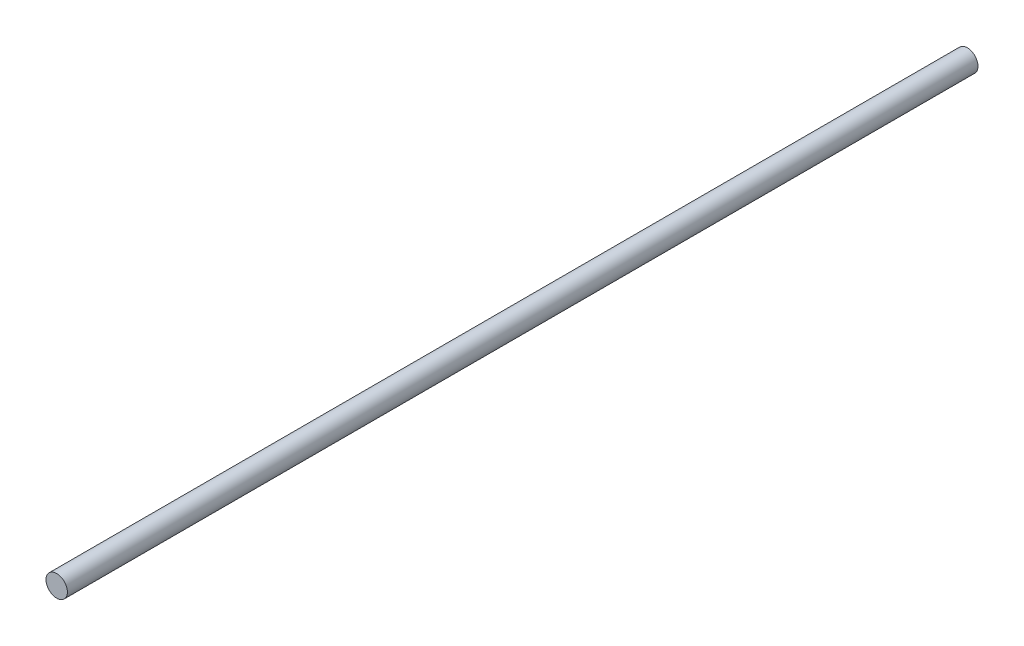
ISO-10303-21;
HEADER;
FILE_DESCRIPTION(('STEP AP214'),'2;1');
FILE_NAME('part.step','',(''),(''),'','','');
FILE_SCHEMA(('AUTOMOTIVE_DESIGN { 1 0 10303 214 1 1 1 1 }'));
ENDSEC;
DATA;
#1=APPLICATION_CONTEXT('core data for automotive mechanical design processes');
#2=APPLICATION_PROTOCOL_DEFINITION('international standard','automotive_design',2000,#1);
#3=PRODUCT_CONTEXT('',#1,'mechanical');
#4=PRODUCT('Part','Part','',(#3));
#5=PRODUCT_RELATED_PRODUCT_CATEGORY('part','',(#4));
#6=PRODUCT_DEFINITION_FORMATION('','',#4);
#7=PRODUCT_DEFINITION_CONTEXT('part definition',#1,'design');
#8=PRODUCT_DEFINITION('design','',#6,#7);
#9=PRODUCT_DEFINITION_SHAPE('','',#8);
#10=(LENGTH_UNIT() NAMED_UNIT(*) SI_UNIT(.MILLI.,.METRE.));
#11=(NAMED_UNIT(*) PLANE_ANGLE_UNIT() SI_UNIT($,.RADIAN.));
#12=(NAMED_UNIT(*) SI_UNIT($,.STERADIAN.) SOLID_ANGLE_UNIT());
#13=UNCERTAINTY_MEASURE_WITH_UNIT(LENGTH_MEASURE(1.E-05),#10,'distance_accuracy_value','');
#14=(GEOMETRIC_REPRESENTATION_CONTEXT(3) GLOBAL_UNCERTAINTY_ASSIGNED_CONTEXT((#13)) GLOBAL_UNIT_ASSIGNED_CONTEXT((#10,
#11,#12)) REPRESENTATION_CONTEXT('',''));
#15=CARTESIAN_POINT('',(0.,0.,0.));
#16=DIRECTION('',(0.,0.,1.));
#17=DIRECTION('',(1.,0.,0.));
#18=AXIS2_PLACEMENT_3D('',#15,#16,#17);
#19=CARTESIAN_POINT('',(0.,0.,135.));
#20=DIRECTION('',(0.,0.,-1.));
#21=DIRECTION('',(-1.,0.,0.));
#22=AXIS2_PLACEMENT_3D('',#19,#20,#21);
#23=CYLINDRICAL_SURFACE('',#22,3.175);
#24=CARTESIAN_POINT('',(0.,0.,135.));
#25=DIRECTION('',(0.,0.,1.));
#26=DIRECTION('',(1.,0.,0.));
#27=AXIS2_PLACEMENT_3D('',#24,#25,#26);
#28=CIRCLE('',#27,3.175);
#29=CARTESIAN_POINT('',(3.175,0.,135.));
#30=VERTEX_POINT('',#29);
#31=EDGE_CURVE('E10',#30,#30,#28,.T.);
#32=ORIENTED_EDGE('',*,*,#31,.F.);
#33=EDGE_LOOP('',(#32));
#34=FACE_BOUND('',#33,.T.);
#35=CARTESIAN_POINT('',(0.,0.,-135.));
#36=DIRECTION('',(0.,0.,1.));
#37=DIRECTION('',(1.,0.,0.));
#38=AXIS2_PLACEMENT_3D('',#35,#36,#37);
#39=CIRCLE('',#38,3.175);
#40=CARTESIAN_POINT('',(3.175,0.,-135.));
#41=VERTEX_POINT('',#40);
#42=EDGE_CURVE('E34',#41,#41,#39,.T.);
#43=ORIENTED_EDGE('',*,*,#42,.T.);
#44=EDGE_LOOP('',(#43));
#45=FACE_BOUND('',#44,.T.);
#46=ADVANCED_FACE('F31',(#34,#45),#23,.T.);
#47=CARTESIAN_POINT('',(0.,0.,135.));
#48=DIRECTION('',(0.,0.,1.));
#49=DIRECTION('',(1.,0.,0.));
#50=AXIS2_PLACEMENT_3D('',#47,#48,#49);
#51=PLANE('',#50);
#52=ORIENTED_EDGE('',*,*,#31,.T.);
#53=EDGE_LOOP('',(#52));
#54=FACE_BOUND('',#53,.T.);
#55=ADVANCED_FACE('F46',(#54),#51,.T.);
#56=CARTESIAN_POINT('',(0.,0.,-135.));
#57=DIRECTION('',(0.,0.,1.));
#58=DIRECTION('',(1.,0.,0.));
#59=AXIS2_PLACEMENT_3D('',#56,#57,#58);
#60=PLANE('',#59);
#61=ORIENTED_EDGE('',*,*,#42,.F.);
#62=EDGE_LOOP('',(#61));
#63=FACE_BOUND('',#62,.T.);
#64=ADVANCED_FACE('F44',(#63),#60,.F.);
#65=CLOSED_SHELL('',(#46,#55,#64));
#66=MANIFOLD_SOLID_BREP('B2',#65);
#67=ADVANCED_BREP_SHAPE_REPRESENTATION('',(#18,#66),#14);
#68=SHAPE_DEFINITION_REPRESENTATION(#9,#67);
ENDSEC;
END-ISO-10303-21;
